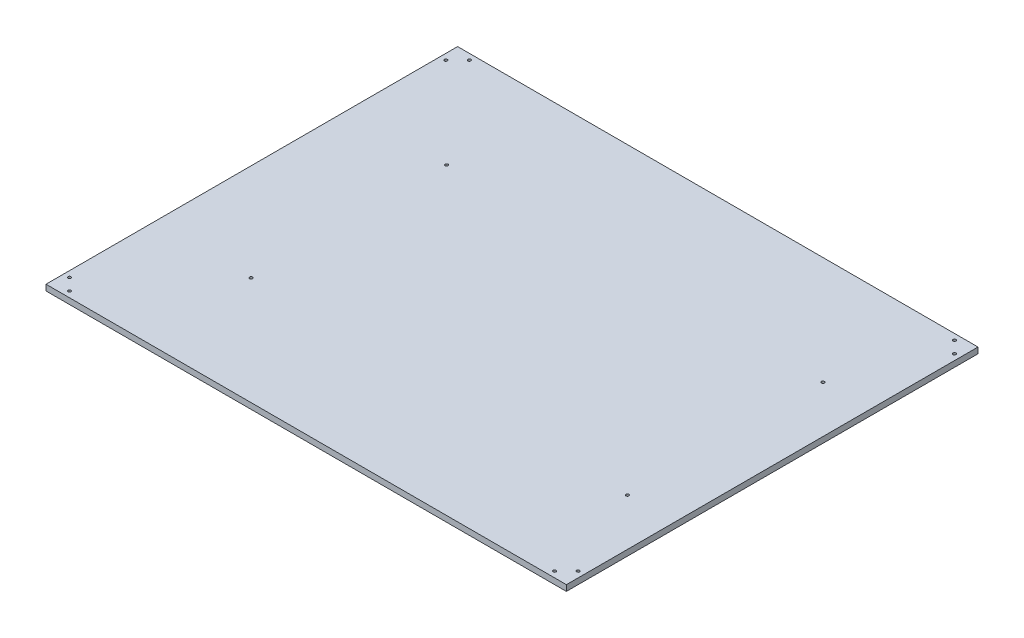
ISO-10303-21;
HEADER;
FILE_DESCRIPTION(('STEP AP214'),'2;1');
FILE_NAME('part.step','',(''),(''),'','','');
FILE_SCHEMA(('AUTOMOTIVE_DESIGN { 1 0 10303 214 1 1 1 1 }'));
ENDSEC;
DATA;
#1=APPLICATION_CONTEXT('core data for automotive mechanical design processes');
#2=APPLICATION_PROTOCOL_DEFINITION('international standard','automotive_design',2000,#1);
#3=PRODUCT_CONTEXT('',#1,'mechanical');
#4=PRODUCT('Part','Part','',(#3));
#5=PRODUCT_RELATED_PRODUCT_CATEGORY('part','',(#4));
#6=PRODUCT_DEFINITION_FORMATION('','',#4);
#7=PRODUCT_DEFINITION_CONTEXT('part definition',#1,'design');
#8=PRODUCT_DEFINITION('design','',#6,#7);
#9=PRODUCT_DEFINITION_SHAPE('','',#8);
#10=(LENGTH_UNIT() NAMED_UNIT(*) SI_UNIT(.MILLI.,.METRE.));
#11=(NAMED_UNIT(*) PLANE_ANGLE_UNIT() SI_UNIT($,.RADIAN.));
#12=(NAMED_UNIT(*) SI_UNIT($,.STERADIAN.) SOLID_ANGLE_UNIT());
#13=UNCERTAINTY_MEASURE_WITH_UNIT(LENGTH_MEASURE(1.E-05),#10,'distance_accuracy_value','');
#14=(GEOMETRIC_REPRESENTATION_CONTEXT(3) GLOBAL_UNCERTAINTY_ASSIGNED_CONTEXT((#13)) GLOBAL_UNIT_ASSIGNED_CONTEXT((#10,
#11,#12)) REPRESENTATION_CONTEXT('',''));
#15=CARTESIAN_POINT('',(0.,0.,0.));
#16=DIRECTION('',(0.,0.,1.));
#17=DIRECTION('',(1.,0.,0.));
#18=AXIS2_PLACEMENT_3D('',#15,#16,#17);
#19=CARTESIAN_POINT('',(0.,10.,0.));
#20=DIRECTION('',(1.,0.,0.));
#21=DIRECTION('',(0.,0.,-1.));
#22=AXIS2_PLACEMENT_3D('',#19,#20,#21);
#23=PLANE('',#22);
#24=DIRECTION('',(0.,0.,1.));
#25=VECTOR('',#24,1.);
#26=CARTESIAN_POINT('',(0.,0.,0.));
#27=LINE('',#26,#25);
#28=CARTESIAN_POINT('',(0.,0.,-700.));
#29=VERTEX_POINT('',#28);
#30=CARTESIAN_POINT('',(0.,0.,0.));
#31=VERTEX_POINT('',#30);
#32=EDGE_CURVE('E114',#29,#31,#27,.T.);
#33=ORIENTED_EDGE('',*,*,#32,.T.);
#34=DIRECTION('',(0.,-1.,0.));
#35=VECTOR('',#34,1.);
#36=CARTESIAN_POINT('',(0.,10.,0.));
#37=LINE('',#36,#35);
#38=CARTESIAN_POINT('',(0.,10.,0.));
#39=VERTEX_POINT('',#38);
#40=EDGE_CURVE('E11',#39,#31,#37,.T.);
#41=ORIENTED_EDGE('',*,*,#40,.F.);
#42=DIRECTION('',(0.,0.,1.));
#43=VECTOR('',#42,1.);
#44=CARTESIAN_POINT('',(0.,10.,0.));
#45=LINE('',#44,#43);
#46=CARTESIAN_POINT('',(0.,10.,-700.));
#47=VERTEX_POINT('',#46);
#48=EDGE_CURVE('E97',#47,#39,#45,.T.);
#49=ORIENTED_EDGE('',*,*,#48,.F.);
#50=DIRECTION('',(0.,-1.,0.));
#51=VECTOR('',#50,1.);
#52=CARTESIAN_POINT('',(0.,10.,-700.));
#53=LINE('',#52,#51);
#54=EDGE_CURVE('E110',#47,#29,#53,.T.);
#55=ORIENTED_EDGE('',*,*,#54,.T.);
#56=EDGE_LOOP('',(#33,#41,#49,#55));
#57=FACE_BOUND('',#56,.T.);
#58=ADVANCED_FACE('F45',(#57),#23,.F.);
#59=CARTESIAN_POINT('',(0.,10.,0.));
#60=DIRECTION('',(0.,0.,-1.));
#61=DIRECTION('',(-1.,0.,0.));
#62=AXIS2_PLACEMENT_3D('',#59,#60,#61);
#63=PLANE('',#62);
#64=DIRECTION('',(1.,0.,0.));
#65=VECTOR('',#64,1.);
#66=CARTESIAN_POINT('',(0.,0.,0.));
#67=LINE('',#66,#65);
#68=CARTESIAN_POINT('',(885.,0.,0.));
#69=VERTEX_POINT('',#68);
#70=EDGE_CURVE('E102',#31,#69,#67,.T.);
#71=ORIENTED_EDGE('',*,*,#70,.T.);
#72=DIRECTION('',(0.,-1.,0.));
#73=VECTOR('',#72,1.);
#74=CARTESIAN_POINT('',(885.,10.,0.));
#75=LINE('',#74,#73);
#76=CARTESIAN_POINT('',(885.,10.,0.));
#77=VERTEX_POINT('',#76);
#78=EDGE_CURVE('E54',#77,#69,#75,.T.);
#79=ORIENTED_EDGE('',*,*,#78,.F.);
#80=DIRECTION('',(1.,0.,0.));
#81=VECTOR('',#80,1.);
#82=CARTESIAN_POINT('',(0.,10.,0.));
#83=LINE('',#82,#81);
#84=EDGE_CURVE('E92',#39,#77,#83,.T.);
#85=ORIENTED_EDGE('',*,*,#84,.F.);
#86=ORIENTED_EDGE('',*,*,#40,.T.);
#87=EDGE_LOOP('',(#71,#79,#85,#86));
#88=FACE_BOUND('',#87,.T.);
#89=ADVANCED_FACE('F101',(#88),#63,.F.);
#90=CARTESIAN_POINT('',(885.,10.,0.));
#91=DIRECTION('',(-1.,0.,0.));
#92=DIRECTION('',(0.,0.,1.));
#93=AXIS2_PLACEMENT_3D('',#90,#91,#92);
#94=PLANE('',#93);
#95=DIRECTION('',(0.,0.,-1.));
#96=VECTOR('',#95,1.);
#97=CARTESIAN_POINT('',(885.,0.,0.));
#98=LINE('',#97,#96);
#99=CARTESIAN_POINT('',(885.,0.,-700.));
#100=VERTEX_POINT('',#99);
#101=EDGE_CURVE('E79',#69,#100,#98,.T.);
#102=ORIENTED_EDGE('',*,*,#101,.T.);
#103=DIRECTION('',(0.,-1.,0.));
#104=VECTOR('',#103,1.);
#105=CARTESIAN_POINT('',(885.,10.,-700.));
#106=LINE('',#105,#104);
#107=CARTESIAN_POINT('',(885.,10.,-700.));
#108=VERTEX_POINT('',#107);
#109=EDGE_CURVE('E104',#108,#100,#106,.T.);
#110=ORIENTED_EDGE('',*,*,#109,.F.);
#111=DIRECTION('',(0.,0.,-1.));
#112=VECTOR('',#111,1.);
#113=CARTESIAN_POINT('',(885.,10.,0.));
#114=LINE('',#113,#112);
#115=EDGE_CURVE('E95',#77,#108,#114,.T.);
#116=ORIENTED_EDGE('',*,*,#115,.F.);
#117=ORIENTED_EDGE('',*,*,#78,.T.);
#118=EDGE_LOOP('',(#102,#110,#116,#117));
#119=FACE_BOUND('',#118,.T.);
#120=ADVANCED_FACE('F105',(#119),#94,.F.);
#121=CARTESIAN_POINT('',(0.,10.,-700.));
#122=DIRECTION('',(0.,0.,1.));
#123=DIRECTION('',(1.,0.,0.));
#124=AXIS2_PLACEMENT_3D('',#121,#122,#123);
#125=PLANE('',#124);
#126=DIRECTION('',(-1.,0.,0.));
#127=VECTOR('',#126,1.);
#128=CARTESIAN_POINT('',(0.,0.,-700.));
#129=LINE('',#128,#127);
#130=EDGE_CURVE('E85',#100,#29,#129,.T.);
#131=ORIENTED_EDGE('',*,*,#130,.T.);
#132=ORIENTED_EDGE('',*,*,#54,.F.);
#133=DIRECTION('',(-1.,0.,0.));
#134=VECTOR('',#133,1.);
#135=CARTESIAN_POINT('',(0.,10.,-700.));
#136=LINE('',#135,#134);
#137=EDGE_CURVE('E62',#108,#47,#136,.T.);
#138=ORIENTED_EDGE('',*,*,#137,.F.);
#139=ORIENTED_EDGE('',*,*,#109,.T.);
#140=EDGE_LOOP('',(#131,#132,#138,#139));
#141=FACE_BOUND('',#140,.T.);
#142=ADVANCED_FACE('F129',(#141),#125,.F.);
#143=CARTESIAN_POINT('',(0.,10.,0.));
#144=DIRECTION('',(0.,-1.,0.));
#145=DIRECTION('',(0.,0.,-1.));
#146=AXIS2_PLACEMENT_3D('',#143,#144,#145);
#147=PLANE('',#146);
#148=CARTESIAN_POINT('',(10.,10.,-30.));
#149=DIRECTION('',(0.,1.,0.));
#150=DIRECTION('',(0.,0.,-1.));
#151=AXIS2_PLACEMENT_3D('',#148,#149,#150);
#152=CIRCLE('',#151,2.49999999999992);
#153=CARTESIAN_POINT('',(10.,10.,-32.4999999999999));
#154=VERTEX_POINT('',#153);
#155=EDGE_CURVE('E225',#154,#154,#152,.T.);
#156=ORIENTED_EDGE('',*,*,#155,.F.);
#157=EDGE_LOOP('',(#156));
#158=FACE_BOUND('',#157,.T.);
#159=CARTESIAN_POINT('',(30.,10.,-10.));
#160=DIRECTION('',(0.,1.,0.));
#161=DIRECTION('',(0.,0.,-1.));
#162=AXIS2_PLACEMENT_3D('',#159,#160,#161);
#163=CIRCLE('',#162,2.49999999999992);
#164=CARTESIAN_POINT('',(30.,10.,-12.4999999999999));
#165=VERTEX_POINT('',#164);
#166=EDGE_CURVE('E217',#165,#165,#163,.T.);
#167=ORIENTED_EDGE('',*,*,#166,.F.);
#168=EDGE_LOOP('',(#167));
#169=FACE_BOUND('',#168,.T.);
#170=CARTESIAN_POINT('',(10.,10.,-670.));
#171=DIRECTION('',(0.,-1.,0.));
#172=DIRECTION('',(0.,0.,1.));
#173=AXIS2_PLACEMENT_3D('',#170,#171,#172);
#174=CIRCLE('',#173,2.49999999999992);
#175=CARTESIAN_POINT('',(10.,10.,-667.5));
#176=VERTEX_POINT('',#175);
#177=EDGE_CURVE('E210',#176,#176,#174,.T.);
#178=ORIENTED_EDGE('',*,*,#177,.T.);
#179=EDGE_LOOP('',(#178));
#180=FACE_BOUND('',#179,.T.);
#181=CARTESIAN_POINT('',(30.,10.,-690.));
#182=DIRECTION('',(0.,-1.,0.));
#183=DIRECTION('',(0.,0.,1.));
#184=AXIS2_PLACEMENT_3D('',#181,#182,#183);
#185=CIRCLE('',#184,2.49999999999992);
#186=CARTESIAN_POINT('',(30.,10.,-687.5));
#187=VERTEX_POINT('',#186);
#188=EDGE_CURVE('E201',#187,#187,#185,.T.);
#189=ORIENTED_EDGE('',*,*,#188,.T.);
#190=EDGE_LOOP('',(#189));
#191=FACE_BOUND('',#190,.T.);
#192=CARTESIAN_POINT('',(875.,10.,-30.));
#193=DIRECTION('',(0.,-1.,0.));
#194=DIRECTION('',(0.,0.,-1.));
#195=AXIS2_PLACEMENT_3D('',#192,#193,#194);
#196=CIRCLE('',#195,2.49999999999992);
#197=CARTESIAN_POINT('',(875.,10.,-32.4999999999999));
#198=VERTEX_POINT('',#197);
#199=EDGE_CURVE('E194',#198,#198,#196,.T.);
#200=ORIENTED_EDGE('',*,*,#199,.T.);
#201=EDGE_LOOP('',(#200));
#202=FACE_BOUND('',#201,.T.);
#203=CARTESIAN_POINT('',(855.,10.,-10.));
#204=DIRECTION('',(0.,-1.,0.));
#205=DIRECTION('',(0.,0.,-1.));
#206=AXIS2_PLACEMENT_3D('',#203,#204,#205);
#207=CIRCLE('',#206,2.49999999999992);
#208=CARTESIAN_POINT('',(855.,10.,-12.4999999999999));
#209=VERTEX_POINT('',#208);
#210=EDGE_CURVE('E185',#209,#209,#207,.T.);
#211=ORIENTED_EDGE('',*,*,#210,.T.);
#212=EDGE_LOOP('',(#211));
#213=FACE_BOUND('',#212,.T.);
#214=CARTESIAN_POINT('',(875.,10.,-670.));
#215=DIRECTION('',(0.,1.,0.));
#216=DIRECTION('',(0.,0.,1.));
#217=AXIS2_PLACEMENT_3D('',#214,#215,#216);
#218=CIRCLE('',#217,2.49999999999992);
#219=CARTESIAN_POINT('',(875.,10.,-667.5));
#220=VERTEX_POINT('',#219);
#221=EDGE_CURVE('E178',#220,#220,#218,.T.);
#222=ORIENTED_EDGE('',*,*,#221,.F.);
#223=EDGE_LOOP('',(#222));
#224=FACE_BOUND('',#223,.T.);
#225=CARTESIAN_POINT('',(855.,10.,-690.));
#226=DIRECTION('',(0.,1.,0.));
#227=DIRECTION('',(0.,0.,1.));
#228=AXIS2_PLACEMENT_3D('',#225,#226,#227);
#229=CIRCLE('',#228,2.49999999999992);
#230=CARTESIAN_POINT('',(855.,10.,-687.5));
#231=VERTEX_POINT('',#230);
#232=EDGE_CURVE('E173',#231,#231,#229,.T.);
#233=ORIENTED_EDGE('',*,*,#232,.F.);
#234=EDGE_LOOP('',(#233));
#235=FACE_BOUND('',#234,.T.);
#236=CARTESIAN_POINT('',(165.,10.,-183.749999999996));
#237=DIRECTION('',(0.,1.,0.));
#238=DIRECTION('',(0.,0.,1.));
#239=AXIS2_PLACEMENT_3D('',#236,#237,#238);
#240=CIRCLE('',#239,2.49999999999991);
#241=CARTESIAN_POINT('',(165.,10.,-181.249999999996));
#242=VERTEX_POINT('',#241);
#243=EDGE_CURVE('E141',#242,#242,#240,.T.);
#244=ORIENTED_EDGE('',*,*,#243,.F.);
#245=EDGE_LOOP('',(#244));
#246=FACE_BOUND('',#245,.T.);
#247=CARTESIAN_POINT('',(805.,10.,-516.25));
#248=DIRECTION('',(0.,1.,0.));
#249=DIRECTION('',(0.,0.,1.));
#250=AXIS2_PLACEMENT_3D('',#247,#248,#249);
#251=CIRCLE('',#250,2.49999999999992);
#252=CARTESIAN_POINT('',(805.,10.,-513.75));
#253=VERTEX_POINT('',#252);
#254=EDGE_CURVE('E149',#253,#253,#251,.T.);
#255=ORIENTED_EDGE('',*,*,#254,.F.);
#256=EDGE_LOOP('',(#255));
#257=FACE_BOUND('',#256,.T.);
#258=CARTESIAN_POINT('',(805.,10.,-183.75));
#259=DIRECTION('',(0.,1.,0.));
#260=DIRECTION('',(0.,0.,1.));
#261=AXIS2_PLACEMENT_3D('',#258,#259,#260);
#262=CIRCLE('',#261,2.49999999999991);
#263=CARTESIAN_POINT('',(805.,10.,-181.25));
#264=VERTEX_POINT('',#263);
#265=EDGE_CURVE('E150',#264,#264,#262,.T.);
#266=ORIENTED_EDGE('',*,*,#265,.F.);
#267=EDGE_LOOP('',(#266));
#268=FACE_BOUND('',#267,.T.);
#269=CARTESIAN_POINT('',(165.,10.,-516.249999999996));
#270=DIRECTION('',(0.,1.,0.));
#271=DIRECTION('',(0.,0.,1.));
#272=AXIS2_PLACEMENT_3D('',#269,#270,#271);
#273=CIRCLE('',#272,2.49999999999992);
#274=CARTESIAN_POINT('',(165.,10.,-513.749999999996));
#275=VERTEX_POINT('',#274);
#276=EDGE_CURVE('E137',#275,#275,#273,.T.);
#277=ORIENTED_EDGE('',*,*,#276,.F.);
#278=EDGE_LOOP('',(#277));
#279=FACE_BOUND('',#278,.T.);
#280=ORIENTED_EDGE('',*,*,#48,.T.);
#281=ORIENTED_EDGE('',*,*,#84,.T.);
#282=ORIENTED_EDGE('',*,*,#115,.T.);
#283=ORIENTED_EDGE('',*,*,#137,.T.);
#284=EDGE_LOOP('',(#280,#281,#282,#283));
#285=FACE_BOUND('',#284,.T.);
#286=ADVANCED_FACE('F93',(#158,#169,#180,#191,#202,#213,#224,#235,#246,#257,#268,#279,#285),
#147,.F.);
#287=CARTESIAN_POINT('',(0.,0.,0.));
#288=DIRECTION('',(0.,-1.,0.));
#289=DIRECTION('',(0.,0.,-1.));
#290=AXIS2_PLACEMENT_3D('',#287,#288,#289);
#291=PLANE('',#290);
#292=CARTESIAN_POINT('',(10.,0.,-30.));
#293=DIRECTION('',(0.,1.,0.));
#294=DIRECTION('',(0.,0.,-1.));
#295=AXIS2_PLACEMENT_3D('',#292,#293,#294);
#296=CIRCLE('',#295,2.49999999999992);
#297=CARTESIAN_POINT('',(10.,0.,-32.4999999999999));
#298=VERTEX_POINT('',#297);
#299=EDGE_CURVE('E206',#298,#298,#296,.T.);
#300=ORIENTED_EDGE('',*,*,#299,.T.);
#301=EDGE_LOOP('',(#300));
#302=FACE_BOUND('',#301,.T.);
#303=CARTESIAN_POINT('',(30.,0.,-10.));
#304=DIRECTION('',(0.,1.,0.));
#305=DIRECTION('',(0.,0.,-1.));
#306=AXIS2_PLACEMENT_3D('',#303,#304,#305);
#307=CIRCLE('',#306,2.49999999999992);
#308=CARTESIAN_POINT('',(30.,0.,-12.4999999999999));
#309=VERTEX_POINT('',#308);
#310=EDGE_CURVE('E221',#309,#309,#307,.T.);
#311=ORIENTED_EDGE('',*,*,#310,.T.);
#312=EDGE_LOOP('',(#311));
#313=FACE_BOUND('',#312,.T.);
#314=CARTESIAN_POINT('',(10.,0.,-670.));
#315=DIRECTION('',(0.,-1.,0.));
#316=DIRECTION('',(0.,0.,1.));
#317=AXIS2_PLACEMENT_3D('',#314,#315,#316);
#318=CIRCLE('',#317,2.49999999999992);
#319=CARTESIAN_POINT('',(10.,0.,-667.5));
#320=VERTEX_POINT('',#319);
#321=EDGE_CURVE('E190',#320,#320,#318,.T.);
#322=ORIENTED_EDGE('',*,*,#321,.F.);
#323=EDGE_LOOP('',(#322));
#324=FACE_BOUND('',#323,.T.);
#325=CARTESIAN_POINT('',(30.,0.,-690.));
#326=DIRECTION('',(0.,-1.,0.));
#327=DIRECTION('',(0.,0.,1.));
#328=AXIS2_PLACEMENT_3D('',#325,#326,#327);
#329=CIRCLE('',#328,2.49999999999992);
#330=CARTESIAN_POINT('',(30.,0.,-687.5));
#331=VERTEX_POINT('',#330);
#332=EDGE_CURVE('E205',#331,#331,#329,.T.);
#333=ORIENTED_EDGE('',*,*,#332,.F.);
#334=EDGE_LOOP('',(#333));
#335=FACE_BOUND('',#334,.T.);
#336=CARTESIAN_POINT('',(875.,0.,-30.));
#337=DIRECTION('',(0.,-1.,0.));
#338=DIRECTION('',(0.,0.,-1.));
#339=AXIS2_PLACEMENT_3D('',#336,#337,#338);
#340=CIRCLE('',#339,2.49999999999992);
#341=CARTESIAN_POINT('',(875.,0.,-32.4999999999999));
#342=VERTEX_POINT('',#341);
#343=EDGE_CURVE('E174',#342,#342,#340,.T.);
#344=ORIENTED_EDGE('',*,*,#343,.F.);
#345=EDGE_LOOP('',(#344));
#346=FACE_BOUND('',#345,.T.);
#347=CARTESIAN_POINT('',(855.,0.,-10.));
#348=DIRECTION('',(0.,-1.,0.));
#349=DIRECTION('',(0.,0.,-1.));
#350=AXIS2_PLACEMENT_3D('',#347,#348,#349);
#351=CIRCLE('',#350,2.49999999999992);
#352=CARTESIAN_POINT('',(855.,0.,-12.4999999999999));
#353=VERTEX_POINT('',#352);
#354=EDGE_CURVE('E189',#353,#353,#351,.T.);
#355=ORIENTED_EDGE('',*,*,#354,.F.);
#356=EDGE_LOOP('',(#355));
#357=FACE_BOUND('',#356,.T.);
#358=CARTESIAN_POINT('',(875.,0.,-670.));
#359=DIRECTION('',(0.,1.,0.));
#360=DIRECTION('',(0.,0.,1.));
#361=AXIS2_PLACEMENT_3D('',#358,#359,#360);
#362=CIRCLE('',#361,2.49999999999992);
#363=CARTESIAN_POINT('',(875.,0.,-667.5));
#364=VERTEX_POINT('',#363);
#365=EDGE_CURVE('E165',#364,#364,#362,.T.);
#366=ORIENTED_EDGE('',*,*,#365,.T.);
#367=EDGE_LOOP('',(#366));
#368=FACE_BOUND('',#367,.T.);
#369=CARTESIAN_POINT('',(855.,0.,-690.));
#370=DIRECTION('',(0.,1.,0.));
#371=DIRECTION('',(0.,0.,1.));
#372=AXIS2_PLACEMENT_3D('',#369,#370,#371);
#373=CIRCLE('',#372,2.49999999999992);
#374=CARTESIAN_POINT('',(855.,0.,-687.5));
#375=VERTEX_POINT('',#374);
#376=EDGE_CURVE('E169',#375,#375,#373,.T.);
#377=ORIENTED_EDGE('',*,*,#376,.T.);
#378=EDGE_LOOP('',(#377));
#379=FACE_BOUND('',#378,.T.);
#380=CARTESIAN_POINT('',(165.,0.,-183.749999999996));
#381=DIRECTION('',(0.,1.,0.));
#382=DIRECTION('',(0.,0.,1.));
#383=AXIS2_PLACEMENT_3D('',#380,#381,#382);
#384=CIRCLE('',#383,2.49999999999991);
#385=CARTESIAN_POINT('',(165.,0.,-181.249999999996));
#386=VERTEX_POINT('',#385);
#387=EDGE_CURVE('E154',#386,#386,#384,.T.);
#388=ORIENTED_EDGE('',*,*,#387,.T.);
#389=EDGE_LOOP('',(#388));
#390=FACE_BOUND('',#389,.T.);
#391=CARTESIAN_POINT('',(805.,0.,-516.25));
#392=DIRECTION('',(0.,1.,0.));
#393=DIRECTION('',(0.,0.,1.));
#394=AXIS2_PLACEMENT_3D('',#391,#392,#393);
#395=CIRCLE('',#394,2.49999999999992);
#396=CARTESIAN_POINT('',(805.,0.,-513.75));
#397=VERTEX_POINT('',#396);
#398=EDGE_CURVE('E145',#397,#397,#395,.T.);
#399=ORIENTED_EDGE('',*,*,#398,.T.);
#400=EDGE_LOOP('',(#399));
#401=FACE_BOUND('',#400,.T.);
#402=CARTESIAN_POINT('',(805.,0.,-183.75));
#403=DIRECTION('',(0.,1.,0.));
#404=DIRECTION('',(0.,0.,1.));
#405=AXIS2_PLACEMENT_3D('',#402,#403,#404);
#406=CIRCLE('',#405,2.49999999999991);
#407=CARTESIAN_POINT('',(805.,0.,-181.25));
#408=VERTEX_POINT('',#407);
#409=EDGE_CURVE('E161',#408,#408,#406,.T.);
#410=ORIENTED_EDGE('',*,*,#409,.T.);
#411=EDGE_LOOP('',(#410));
#412=FACE_BOUND('',#411,.T.);
#413=CARTESIAN_POINT('',(165.,0.,-516.249999999996));
#414=DIRECTION('',(0.,1.,0.));
#415=DIRECTION('',(0.,0.,1.));
#416=AXIS2_PLACEMENT_3D('',#413,#414,#415);
#417=CIRCLE('',#416,2.49999999999992);
#418=CARTESIAN_POINT('',(165.,0.,-513.749999999996));
#419=VERTEX_POINT('',#418);
#420=EDGE_CURVE('E118',#419,#419,#417,.T.);
#421=ORIENTED_EDGE('',*,*,#420,.T.);
#422=EDGE_LOOP('',(#421));
#423=FACE_BOUND('',#422,.T.);
#424=ORIENTED_EDGE('',*,*,#32,.F.);
#425=ORIENTED_EDGE('',*,*,#130,.F.);
#426=ORIENTED_EDGE('',*,*,#101,.F.);
#427=ORIENTED_EDGE('',*,*,#70,.F.);
#428=EDGE_LOOP('',(#424,#425,#426,#427));
#429=FACE_BOUND('',#428,.T.);
#430=ADVANCED_FACE('F132',(#302,#313,#324,#335,#346,#357,#368,#379,#390,#401,#412,#423,#429),
#291,.T.);
#431=CARTESIAN_POINT('',(165.,0.,-516.249999999996));
#432=DIRECTION('',(0.,1.,0.));
#433=DIRECTION('',(0.,0.,1.));
#434=AXIS2_PLACEMENT_3D('',#431,#432,#433);
#435=CYLINDRICAL_SURFACE('',#434,2.49999999999992);
#436=ORIENTED_EDGE('',*,*,#420,.F.);
#437=EDGE_LOOP('',(#436));
#438=FACE_BOUND('',#437,.T.);
#439=ORIENTED_EDGE('',*,*,#276,.T.);
#440=EDGE_LOOP('',(#439));
#441=FACE_BOUND('',#440,.T.);
#442=ADVANCED_FACE('F268',(#438,#441),#435,.F.);
#443=CARTESIAN_POINT('',(805.,0.,-183.75));
#444=DIRECTION('',(0.,1.,0.));
#445=DIRECTION('',(0.,0.,1.));
#446=AXIS2_PLACEMENT_3D('',#443,#444,#445);
#447=CYLINDRICAL_SURFACE('',#446,2.49999999999991);
#448=ORIENTED_EDGE('',*,*,#409,.F.);
#449=EDGE_LOOP('',(#448));
#450=FACE_BOUND('',#449,.T.);
#451=ORIENTED_EDGE('',*,*,#265,.T.);
#452=EDGE_LOOP('',(#451));
#453=FACE_BOUND('',#452,.T.);
#454=ADVANCED_FACE('F270',(#450,#453),#447,.F.);
#455=CARTESIAN_POINT('',(805.,0.,-516.25));
#456=DIRECTION('',(0.,1.,0.));
#457=DIRECTION('',(0.,0.,1.));
#458=AXIS2_PLACEMENT_3D('',#455,#456,#457);
#459=CYLINDRICAL_SURFACE('',#458,2.49999999999992);
#460=ORIENTED_EDGE('',*,*,#398,.F.);
#461=EDGE_LOOP('',(#460));
#462=FACE_BOUND('',#461,.T.);
#463=ORIENTED_EDGE('',*,*,#254,.T.);
#464=EDGE_LOOP('',(#463));
#465=FACE_BOUND('',#464,.T.);
#466=ADVANCED_FACE('F277',(#462,#465),#459,.F.);
#467=CARTESIAN_POINT('',(165.,0.,-183.749999999996));
#468=DIRECTION('',(0.,1.,0.));
#469=DIRECTION('',(0.,0.,1.));
#470=AXIS2_PLACEMENT_3D('',#467,#468,#469);
#471=CYLINDRICAL_SURFACE('',#470,2.49999999999991);
#472=ORIENTED_EDGE('',*,*,#387,.F.);
#473=EDGE_LOOP('',(#472));
#474=FACE_BOUND('',#473,.T.);
#475=ORIENTED_EDGE('',*,*,#243,.T.);
#476=EDGE_LOOP('',(#475));
#477=FACE_BOUND('',#476,.T.);
#478=ADVANCED_FACE('F393',(#474,#477),#471,.F.);
#479=CARTESIAN_POINT('',(855.,0.,-690.));
#480=DIRECTION('',(0.,1.,0.));
#481=DIRECTION('',(0.,0.,1.));
#482=AXIS2_PLACEMENT_3D('',#479,#480,#481);
#483=CYLINDRICAL_SURFACE('',#482,2.49999999999992);
#484=ORIENTED_EDGE('',*,*,#376,.F.);
#485=EDGE_LOOP('',(#484));
#486=FACE_BOUND('',#485,.T.);
#487=ORIENTED_EDGE('',*,*,#232,.T.);
#488=EDGE_LOOP('',(#487));
#489=FACE_BOUND('',#488,.T.);
#490=ADVANCED_FACE('F383',(#486,#489),#483,.F.);
#491=CARTESIAN_POINT('',(875.,0.,-670.));
#492=DIRECTION('',(0.,1.,0.));
#493=DIRECTION('',(0.,0.,1.));
#494=AXIS2_PLACEMENT_3D('',#491,#492,#493);
#495=CYLINDRICAL_SURFACE('',#494,2.49999999999992);
#496=ORIENTED_EDGE('',*,*,#365,.F.);
#497=EDGE_LOOP('',(#496));
#498=FACE_BOUND('',#497,.T.);
#499=ORIENTED_EDGE('',*,*,#221,.T.);
#500=EDGE_LOOP('',(#499));
#501=FACE_BOUND('',#500,.T.);
#502=ADVANCED_FACE('F373',(#498,#501),#495,.F.);
#503=CARTESIAN_POINT('',(855.,0.,-10.));
#504=DIRECTION('',(0.,1.,0.));
#505=DIRECTION('',(0.,0.,1.));
#506=AXIS2_PLACEMENT_3D('',#503,#504,#505);
#507=CYLINDRICAL_SURFACE('',#506,2.49999999999992);
#508=ORIENTED_EDGE('',*,*,#354,.T.);
#509=EDGE_LOOP('',(#508));
#510=FACE_BOUND('',#509,.T.);
#511=ORIENTED_EDGE('',*,*,#210,.F.);
#512=EDGE_LOOP('',(#511));
#513=FACE_BOUND('',#512,.T.);
#514=ADVANCED_FACE('F364',(#510,#513),#507,.F.);
#515=CARTESIAN_POINT('',(875.,0.,-30.));
#516=DIRECTION('',(0.,1.,0.));
#517=DIRECTION('',(0.,0.,1.));
#518=AXIS2_PLACEMENT_3D('',#515,#516,#517);
#519=CYLINDRICAL_SURFACE('',#518,2.49999999999992);
#520=ORIENTED_EDGE('',*,*,#343,.T.);
#521=EDGE_LOOP('',(#520));
#522=FACE_BOUND('',#521,.T.);
#523=ORIENTED_EDGE('',*,*,#199,.F.);
#524=EDGE_LOOP('',(#523));
#525=FACE_BOUND('',#524,.T.);
#526=ADVANCED_FACE('F322',(#522,#525),#519,.F.);
#527=CARTESIAN_POINT('',(30.,0.,-690.));
#528=DIRECTION('',(0.,1.,0.));
#529=DIRECTION('',(0.,0.,1.));
#530=AXIS2_PLACEMENT_3D('',#527,#528,#529);
#531=CYLINDRICAL_SURFACE('',#530,2.49999999999992);
#532=ORIENTED_EDGE('',*,*,#332,.T.);
#533=EDGE_LOOP('',(#532));
#534=FACE_BOUND('',#533,.T.);
#535=ORIENTED_EDGE('',*,*,#188,.F.);
#536=EDGE_LOOP('',(#535));
#537=FACE_BOUND('',#536,.T.);
#538=ADVANCED_FACE('F316',(#534,#537),#531,.F.);
#539=CARTESIAN_POINT('',(10.,0.,-670.));
#540=DIRECTION('',(0.,1.,0.));
#541=DIRECTION('',(0.,0.,1.));
#542=AXIS2_PLACEMENT_3D('',#539,#540,#541);
#543=CYLINDRICAL_SURFACE('',#542,2.49999999999992);
#544=ORIENTED_EDGE('',*,*,#321,.T.);
#545=EDGE_LOOP('',(#544));
#546=FACE_BOUND('',#545,.T.);
#547=ORIENTED_EDGE('',*,*,#177,.F.);
#548=EDGE_LOOP('',(#547));
#549=FACE_BOUND('',#548,.T.);
#550=ADVANCED_FACE('F321',(#546,#549),#543,.F.);
#551=CARTESIAN_POINT('',(30.,0.,-10.));
#552=DIRECTION('',(0.,1.,0.));
#553=DIRECTION('',(0.,0.,1.));
#554=AXIS2_PLACEMENT_3D('',#551,#552,#553);
#555=CYLINDRICAL_SURFACE('',#554,2.49999999999992);
#556=ORIENTED_EDGE('',*,*,#310,.F.);
#557=EDGE_LOOP('',(#556));
#558=FACE_BOUND('',#557,.T.);
#559=ORIENTED_EDGE('',*,*,#166,.T.);
#560=EDGE_LOOP('',(#559));
#561=FACE_BOUND('',#560,.T.);
#562=ADVANCED_FACE('F239',(#558,#561),#555,.F.);
#563=CARTESIAN_POINT('',(10.,0.,-30.));
#564=DIRECTION('',(0.,1.,0.));
#565=DIRECTION('',(0.,0.,1.));
#566=AXIS2_PLACEMENT_3D('',#563,#564,#565);
#567=CYLINDRICAL_SURFACE('',#566,2.49999999999992);
#568=ORIENTED_EDGE('',*,*,#299,.F.);
#569=EDGE_LOOP('',(#568));
#570=FACE_BOUND('',#569,.T.);
#571=ORIENTED_EDGE('',*,*,#155,.T.);
#572=EDGE_LOOP('',(#571));
#573=FACE_BOUND('',#572,.T.);
#574=ADVANCED_FACE('F236',(#570,#573),#567,.F.);
#575=CLOSED_SHELL('',(#58,#89,#120,#142,#286,#430,#442,#454,#466,#478,#490,#502,#514,#526,#538,
#550,#562,#574));
#576=MANIFOLD_SOLID_BREP('B2',#575);
#577=ADVANCED_BREP_SHAPE_REPRESENTATION('',(#18,#576),#14);
#578=SHAPE_DEFINITION_REPRESENTATION(#9,#577);
ENDSEC;
END-ISO-10303-21;
